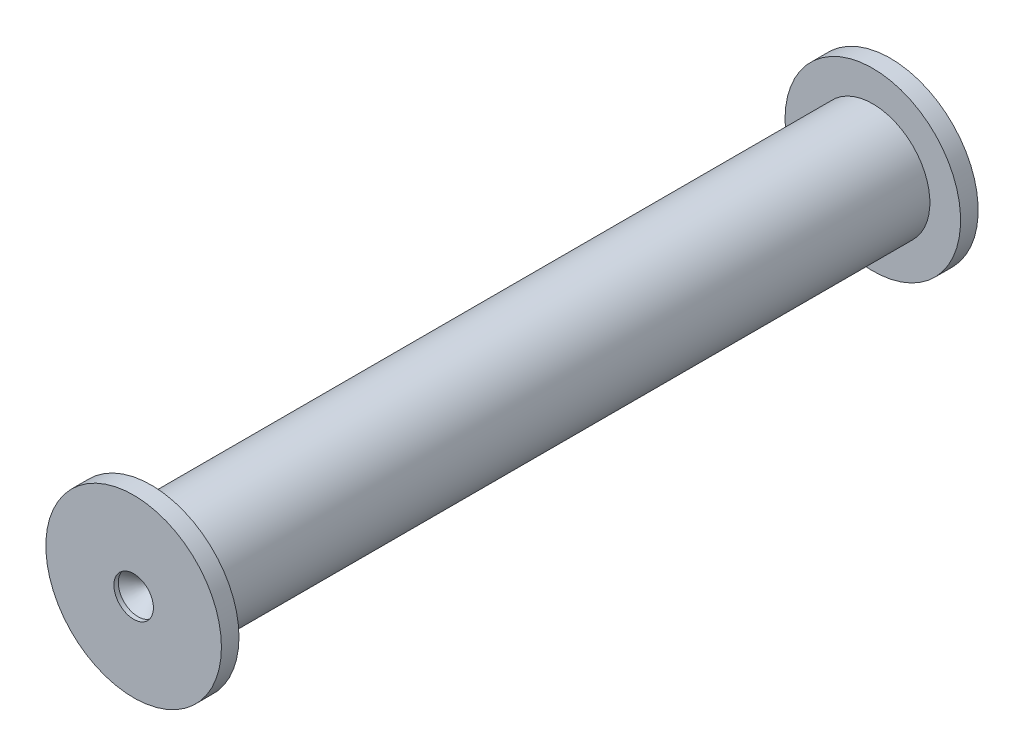
ISO-10303-21;
HEADER;
FILE_DESCRIPTION(('STEP AP214'),'2;1');
FILE_NAME('part.step','',(''),(''),'','','');
FILE_SCHEMA(('AUTOMOTIVE_DESIGN { 1 0 10303 214 1 1 1 1 }'));
ENDSEC;
DATA;
#1=APPLICATION_CONTEXT('core data for automotive mechanical design processes');
#2=APPLICATION_PROTOCOL_DEFINITION('international standard','automotive_design',2000,#1);
#3=PRODUCT_CONTEXT('',#1,'mechanical');
#4=PRODUCT('Part','Part','',(#3));
#5=PRODUCT_RELATED_PRODUCT_CATEGORY('part','',(#4));
#6=PRODUCT_DEFINITION_FORMATION('','',#4);
#7=PRODUCT_DEFINITION_CONTEXT('part definition',#1,'design');
#8=PRODUCT_DEFINITION('design','',#6,#7);
#9=PRODUCT_DEFINITION_SHAPE('','',#8);
#10=(LENGTH_UNIT() NAMED_UNIT(*) SI_UNIT(.MILLI.,.METRE.));
#11=(NAMED_UNIT(*) PLANE_ANGLE_UNIT() SI_UNIT($,.RADIAN.));
#12=(NAMED_UNIT(*) SI_UNIT($,.STERADIAN.) SOLID_ANGLE_UNIT());
#13=UNCERTAINTY_MEASURE_WITH_UNIT(LENGTH_MEASURE(1.E-05),#10,'distance_accuracy_value','');
#14=(GEOMETRIC_REPRESENTATION_CONTEXT(3) GLOBAL_UNCERTAINTY_ASSIGNED_CONTEXT((#13)) GLOBAL_UNIT_ASSIGNED_CONTEXT((#10,
#11,#12)) REPRESENTATION_CONTEXT('',''));
#15=CARTESIAN_POINT('',(0.,0.,0.));
#16=DIRECTION('',(0.,0.,1.));
#17=DIRECTION('',(1.,0.,0.));
#18=AXIS2_PLACEMENT_3D('',#15,#16,#17);
#19=CARTESIAN_POINT('',(3.3,-31.2819394424174,0.1));
#20=DIRECTION('',(0.,0.,-1.));
#21=DIRECTION('',(-1.,0.,0.));
#22=AXIS2_PLACEMENT_3D('',#19,#20,#21);
#23=CYLINDRICAL_SURFACE('',#22,1.3);
#24=CARTESIAN_POINT('',(3.3,-31.2819394424174,0.1));
#25=DIRECTION('',(0.,0.,1.));
#26=DIRECTION('',(1.,0.,0.));
#27=AXIS2_PLACEMENT_3D('',#24,#25,#26);
#28=CIRCLE('',#27,1.3);
#29=CARTESIAN_POINT('',(4.6,-31.2819394424174,0.1));
#30=VERTEX_POINT('',#29);
#31=EDGE_CURVE('E50',#30,#30,#28,.T.);
#32=ORIENTED_EDGE('',*,*,#31,.F.);
#33=EDGE_LOOP('',(#32));
#34=FACE_BOUND('',#33,.T.);
#35=CARTESIAN_POINT('',(3.3,-31.2819394424174,-16.34));
#36=DIRECTION('',(0.,0.,-1.));
#37=DIRECTION('',(-1.,0.,0.));
#38=AXIS2_PLACEMENT_3D('',#35,#36,#37);
#39=CIRCLE('',#38,1.3);
#40=CARTESIAN_POINT('',(2.,-31.2819394424174,-16.34));
#41=VERTEX_POINT('',#40);
#42=EDGE_CURVE('E57',#41,#41,#39,.T.);
#43=ORIENTED_EDGE('',*,*,#42,.F.);
#44=EDGE_LOOP('',(#43));
#45=FACE_BOUND('',#44,.T.);
#46=ADVANCED_FACE('F30',(#34,#45),#23,.T.);
#47=CARTESIAN_POINT('',(3.3,-31.2819394424174,0.1));
#48=DIRECTION('',(0.,0.,1.));
#49=DIRECTION('',(1.,0.,0.));
#50=AXIS2_PLACEMENT_3D('',#47,#48,#49);
#51=PLANE('',#50);
#52=CARTESIAN_POINT('',(3.3,-31.2819394424174,0.1));
#53=DIRECTION('',(0.,0.,1.));
#54=DIRECTION('',(1.,0.,0.));
#55=AXIS2_PLACEMENT_3D('',#52,#53,#54);
#56=CIRCLE('',#55,2.);
#57=CARTESIAN_POINT('',(5.3,-31.2819394424174,0.1));
#58=VERTEX_POINT('',#57);
#59=EDGE_CURVE('E54',#58,#58,#56,.T.);
#60=ORIENTED_EDGE('',*,*,#59,.F.);
#61=EDGE_LOOP('',(#60));
#62=FACE_BOUND('',#61,.T.);
#63=ORIENTED_EDGE('',*,*,#31,.T.);
#64=EDGE_LOOP('',(#63));
#65=FACE_BOUND('',#64,.T.);
#66=ADVANCED_FACE('F87',(#62,#65),#51,.F.);
#67=CARTESIAN_POINT('',(3.3,-31.2819394424174,0.5));
#68=DIRECTION('',(0.,0.,-1.));
#69=DIRECTION('',(-1.,0.,0.));
#70=AXIS2_PLACEMENT_3D('',#67,#68,#69);
#71=CYLINDRICAL_SURFACE('',#70,2.);
#72=CARTESIAN_POINT('',(3.3,-31.2819394424174,0.5));
#73=DIRECTION('',(0.,0.,1.));
#74=DIRECTION('',(1.,0.,0.));
#75=AXIS2_PLACEMENT_3D('',#72,#73,#74);
#76=CIRCLE('',#75,2.);
#77=CARTESIAN_POINT('',(5.3,-31.2819394424174,0.5));
#78=VERTEX_POINT('',#77);
#79=EDGE_CURVE('E53',#78,#78,#76,.T.);
#80=ORIENTED_EDGE('',*,*,#79,.F.);
#81=EDGE_LOOP('',(#80));
#82=FACE_BOUND('',#81,.T.);
#83=ORIENTED_EDGE('',*,*,#59,.T.);
#84=EDGE_LOOP('',(#83));
#85=FACE_BOUND('',#84,.T.);
#86=ADVANCED_FACE('F81',(#82,#85),#71,.T.);
#87=CARTESIAN_POINT('',(3.3,-31.2819394424174,0.5));
#88=DIRECTION('',(0.,0.,1.));
#89=DIRECTION('',(1.,0.,0.));
#90=AXIS2_PLACEMENT_3D('',#87,#88,#89);
#91=PLANE('',#90);
#92=CARTESIAN_POINT('',(3.3,-31.2819394424174,0.5));
#93=DIRECTION('',(0.,0.,1.));
#94=DIRECTION('',(1.,0.,0.));
#95=AXIS2_PLACEMENT_3D('',#92,#93,#94);
#96=CIRCLE('',#95,0.449999999999999);
#97=CARTESIAN_POINT('',(3.75,-31.2819394424174,0.5));
#98=VERTEX_POINT('',#97);
#99=EDGE_CURVE('E71',#98,#98,#96,.T.);
#100=ORIENTED_EDGE('',*,*,#99,.F.);
#101=EDGE_LOOP('',(#100));
#102=FACE_BOUND('',#101,.T.);
#103=ORIENTED_EDGE('',*,*,#79,.T.);
#104=EDGE_LOOP('',(#103));
#105=FACE_BOUND('',#104,.T.);
#106=ADVANCED_FACE('F77',(#102,#105),#91,.T.);
#107=CARTESIAN_POINT('',(3.3,-31.2819394424174,-16.34));
#108=DIRECTION('',(0.,0.,-1.));
#109=DIRECTION('',(-1.,0.,0.));
#110=AXIS2_PLACEMENT_3D('',#107,#108,#109);
#111=PLANE('',#110);
#112=CARTESIAN_POINT('',(3.3,-31.2819394424174,-16.34));
#113=DIRECTION('',(0.,0.,-1.));
#114=DIRECTION('',(-1.,0.,0.));
#115=AXIS2_PLACEMENT_3D('',#112,#113,#114);
#116=CIRCLE('',#115,2.);
#117=CARTESIAN_POINT('',(1.3,-31.2819394424174,-16.34));
#118=VERTEX_POINT('',#117);
#119=EDGE_CURVE('E63',#118,#118,#116,.T.);
#120=ORIENTED_EDGE('',*,*,#119,.F.);
#121=EDGE_LOOP('',(#120));
#122=FACE_BOUND('',#121,.T.);
#123=ORIENTED_EDGE('',*,*,#42,.T.);
#124=EDGE_LOOP('',(#123));
#125=FACE_BOUND('',#124,.T.);
#126=ADVANCED_FACE('F80',(#122,#125),#111,.F.);
#127=CARTESIAN_POINT('',(3.3,-31.2819394424174,-16.74));
#128=DIRECTION('',(0.,0.,1.));
#129=DIRECTION('',(1.,0.,0.));
#130=AXIS2_PLACEMENT_3D('',#127,#128,#129);
#131=CYLINDRICAL_SURFACE('',#130,2.);
#132=CARTESIAN_POINT('',(3.3,-31.2819394424174,-16.74));
#133=DIRECTION('',(0.,0.,-1.));
#134=DIRECTION('',(-1.,0.,0.));
#135=AXIS2_PLACEMENT_3D('',#132,#133,#134);
#136=CIRCLE('',#135,2.);
#137=CARTESIAN_POINT('',(1.3,-31.2819394424174,-16.74));
#138=VERTEX_POINT('',#137);
#139=EDGE_CURVE('E62',#138,#138,#136,.T.);
#140=ORIENTED_EDGE('',*,*,#139,.F.);
#141=EDGE_LOOP('',(#140));
#142=FACE_BOUND('',#141,.T.);
#143=ORIENTED_EDGE('',*,*,#119,.T.);
#144=EDGE_LOOP('',(#143));
#145=FACE_BOUND('',#144,.T.);
#146=ADVANCED_FACE('F102',(#142,#145),#131,.T.);
#147=CARTESIAN_POINT('',(3.3,-31.2819394424174,-16.74));
#148=DIRECTION('',(0.,0.,-1.));
#149=DIRECTION('',(-1.,0.,0.));
#150=AXIS2_PLACEMENT_3D('',#147,#148,#149);
#151=PLANE('',#150);
#152=CARTESIAN_POINT('',(3.3,-31.2819394424174,-16.74));
#153=DIRECTION('',(0.,0.,-1.));
#154=DIRECTION('',(-1.,0.,0.));
#155=AXIS2_PLACEMENT_3D('',#152,#153,#154);
#156=CIRCLE('',#155,0.449999999999999);
#157=CARTESIAN_POINT('',(2.85,-31.2819394424174,-16.74));
#158=VERTEX_POINT('',#157);
#159=EDGE_CURVE('E66',#158,#158,#156,.T.);
#160=ORIENTED_EDGE('',*,*,#159,.F.);
#161=EDGE_LOOP('',(#160));
#162=FACE_BOUND('',#161,.T.);
#163=ORIENTED_EDGE('',*,*,#139,.T.);
#164=EDGE_LOOP('',(#163));
#165=FACE_BOUND('',#164,.T.);
#166=ADVANCED_FACE('F108',(#162,#165),#151,.T.);
#167=CARTESIAN_POINT('',(3.3,-31.2819394424174,-16.24));
#168=DIRECTION('',(0.,0.,-1.));
#169=DIRECTION('',(-1.,0.,0.));
#170=AXIS2_PLACEMENT_3D('',#167,#168,#169);
#171=CYLINDRICAL_SURFACE('',#170,0.449999999999999);
#172=CARTESIAN_POINT('',(3.3,-31.2819394424174,-16.64));
#173=DIRECTION('',(0.,0.,-1.));
#174=DIRECTION('',(-1.,0.,0.));
#175=AXIS2_PLACEMENT_3D('',#172,#173,#174);
#176=CIRCLE('',#175,0.449999999999999);
#177=CARTESIAN_POINT('',(2.85,-31.2819394424174,-16.64));
#178=VERTEX_POINT('',#177);
#179=EDGE_CURVE('E41',#178,#178,#176,.F.);
#180=ORIENTED_EDGE('',*,*,#179,.T.);
#181=EDGE_LOOP('',(#180));
#182=FACE_BOUND('',#181,.T.);
#183=ORIENTED_EDGE('',*,*,#159,.T.);
#184=EDGE_LOOP('',(#183));
#185=FACE_BOUND('',#184,.T.);
#186=ADVANCED_FACE('F124',(#182,#185),#171,.F.);
#187=CARTESIAN_POINT('',(3.3,-31.2819394424174,-16.24));
#188=DIRECTION('',(0.,0.,-1.));
#189=DIRECTION('',(-1.,0.,0.));
#190=AXIS2_PLACEMENT_3D('',#187,#188,#189);
#191=PLANE('',#190);
#192=CARTESIAN_POINT('',(3.3,-31.2819394424174,-16.24));
#193=DIRECTION('',(0.,0.,-1.));
#194=DIRECTION('',(-1.,0.,0.));
#195=AXIS2_PLACEMENT_3D('',#192,#193,#194);
#196=CIRCLE('',#195,0.049999999999998);
#197=CARTESIAN_POINT('',(3.25,-31.2819394424174,-16.24));
#198=VERTEX_POINT('',#197);
#199=EDGE_CURVE('E45',#198,#198,#196,.T.);
#200=ORIENTED_EDGE('',*,*,#199,.T.);
#201=EDGE_LOOP('',(#200));
#202=FACE_BOUND('',#201,.T.);
#203=ADVANCED_FACE('F116',(#202),#191,.T.);
#204=CARTESIAN_POINT('',(3.3,-31.2819394424174,-16.24));
#205=DIRECTION('',(0.,0.,-1.));
#206=DIRECTION('',(-1.,0.,0.));
#207=AXIS2_PLACEMENT_3D('',#204,#205,#206);
#208=CONICAL_SURFACE('',#207,0.049999999999998,0.785398163397449);
#209=CARTESIAN_POINT('',(2.85,-31.2819394424174,-16.64));
#210=CARTESIAN_POINT('',(2.85416666666667,-31.2819394424174,-16.6358333333333));
#211=CARTESIAN_POINT('',(2.85833333333333,-31.2819394424174,-16.6316666666667));
#212=CARTESIAN_POINT('',(2.86666666666667,-31.2819394424174,-16.6233333333333));
#213=CARTESIAN_POINT('',(2.87083333333334,-31.2819394424174,-16.6191666666667));
#214=CARTESIAN_POINT('',(2.87916666666667,-31.2819394424174,-16.6108333333333));
#215=CARTESIAN_POINT('',(2.88333333333334,-31.2819394424174,-16.6066666666667));
#216=CARTESIAN_POINT('',(2.89166666666667,-31.2819394424174,-16.5983333333333));
#217=CARTESIAN_POINT('',(2.89583333333334,-31.2819394424174,-16.5941666666667));
#218=CARTESIAN_POINT('',(2.90416666666667,-31.2819394424174,-16.5858333333333));
#219=CARTESIAN_POINT('',(2.90833333333334,-31.2819394424174,-16.5816666666667));
#220=CARTESIAN_POINT('',(2.91666666666667,-31.2819394424174,-16.5733333333333));
#221=CARTESIAN_POINT('',(2.92083333333334,-31.2819394424174,-16.5691666666667));
#222=CARTESIAN_POINT('',(2.92916666666667,-31.2819394424174,-16.5608333333333));
#223=CARTESIAN_POINT('',(2.93333333333334,-31.2819394424174,-16.5566666666667));
#224=CARTESIAN_POINT('',(2.94166666666667,-31.2819394424174,-16.5483333333333));
#225=CARTESIAN_POINT('',(2.94583333333334,-31.2819394424174,-16.5441666666667));
#226=CARTESIAN_POINT('',(2.95416666666667,-31.2819394424174,-16.5358333333333));
#227=CARTESIAN_POINT('',(2.95833333333334,-31.2819394424174,-16.5316666666667));
#228=CARTESIAN_POINT('',(2.96666666666667,-31.2819394424174,-16.5233333333333));
#229=CARTESIAN_POINT('',(2.97083333333334,-31.2819394424174,-16.5191666666667));
#230=CARTESIAN_POINT('',(2.97916666666667,-31.2819394424174,-16.5108333333333));
#231=CARTESIAN_POINT('',(2.98333333333334,-31.2819394424174,-16.5066666666667));
#232=CARTESIAN_POINT('',(2.99166666666667,-31.2819394424174,-16.4983333333333));
#233=CARTESIAN_POINT('',(2.99583333333334,-31.2819394424174,-16.4941666666667));
#234=CARTESIAN_POINT('',(3.00416666666667,-31.2819394424174,-16.4858333333333));
#235=CARTESIAN_POINT('',(3.00833333333334,-31.2819394424174,-16.4816666666667));
#236=CARTESIAN_POINT('',(3.01666666666667,-31.2819394424174,-16.4733333333333));
#237=CARTESIAN_POINT('',(3.02083333333334,-31.2819394424174,-16.4691666666667));
#238=CARTESIAN_POINT('',(3.02916666666667,-31.2819394424174,-16.4608333333333));
#239=CARTESIAN_POINT('',(3.03333333333334,-31.2819394424174,-16.4566666666667));
#240=CARTESIAN_POINT('',(3.04166666666667,-31.2819394424174,-16.4483333333333));
#241=CARTESIAN_POINT('',(3.04583333333334,-31.2819394424174,-16.4441666666667));
#242=CARTESIAN_POINT('',(3.05416666666667,-31.2819394424174,-16.4358333333333));
#243=CARTESIAN_POINT('',(3.05833333333334,-31.2819394424174,-16.4316666666667));
#244=CARTESIAN_POINT('',(3.06666666666667,-31.2819394424174,-16.4233333333333));
#245=CARTESIAN_POINT('',(3.07083333333334,-31.2819394424174,-16.4191666666667));
#246=CARTESIAN_POINT('',(3.07916666666667,-31.2819394424174,-16.4108333333333));
#247=CARTESIAN_POINT('',(3.08333333333334,-31.2819394424174,-16.4066666666667));
#248=CARTESIAN_POINT('',(3.09166666666667,-31.2819394424174,-16.3983333333333));
#249=CARTESIAN_POINT('',(3.09583333333334,-31.2819394424174,-16.3941666666667));
#250=CARTESIAN_POINT('',(3.10416666666667,-31.2819394424174,-16.3858333333333));
#251=CARTESIAN_POINT('',(3.10833333333334,-31.2819394424174,-16.3816666666667));
#252=CARTESIAN_POINT('',(3.11666666666667,-31.2819394424174,-16.3733333333333));
#253=CARTESIAN_POINT('',(3.12083333333334,-31.2819394424174,-16.3691666666667));
#254=CARTESIAN_POINT('',(3.12916666666667,-31.2819394424174,-16.3608333333333));
#255=CARTESIAN_POINT('',(3.13333333333334,-31.2819394424174,-16.3566666666667));
#256=CARTESIAN_POINT('',(3.14166666666667,-31.2819394424174,-16.3483333333333));
#257=CARTESIAN_POINT('',(3.14583333333334,-31.2819394424174,-16.3441666666667));
#258=CARTESIAN_POINT('',(3.15416666666667,-31.2819394424174,-16.3358333333333));
#259=CARTESIAN_POINT('',(3.15833333333334,-31.2819394424174,-16.3316666666667));
#260=CARTESIAN_POINT('',(3.16666666666667,-31.2819394424174,-16.3233333333333));
#261=CARTESIAN_POINT('',(3.17083333333334,-31.2819394424174,-16.3191666666667));
#262=CARTESIAN_POINT('',(3.17916666666667,-31.2819394424174,-16.3108333333333));
#263=CARTESIAN_POINT('',(3.18333333333334,-31.2819394424174,-16.3066666666667));
#264=CARTESIAN_POINT('',(3.19166666666667,-31.2819394424174,-16.2983333333333));
#265=CARTESIAN_POINT('',(3.19583333333334,-31.2819394424174,-16.2941666666667));
#266=CARTESIAN_POINT('',(3.20416666666667,-31.2819394424174,-16.2858333333333));
#267=CARTESIAN_POINT('',(3.20833333333334,-31.2819394424174,-16.2816666666667));
#268=CARTESIAN_POINT('',(3.21666666666667,-31.2819394424174,-16.2733333333333));
#269=CARTESIAN_POINT('',(3.22083333333334,-31.2819394424174,-16.2691666666667));
#270=CARTESIAN_POINT('',(3.22916666666667,-31.2819394424174,-16.2608333333333));
#271=CARTESIAN_POINT('',(3.23333333333334,-31.2819394424174,-16.2566666666667));
#272=CARTESIAN_POINT('',(3.24166666666667,-31.2819394424174,-16.2483333333333));
#273=CARTESIAN_POINT('',(3.24583333333334,-31.2819394424174,-16.2441666666667));
#274=CARTESIAN_POINT('',(3.25,-31.2819394424174,-16.24));
#275=B_SPLINE_CURVE_WITH_KNOTS('',3,(#209,#210,#211,#212,#213,#214,#215,#216,#217,#218,#219,
#220,#221,#222,#223,#224,#225,#226,#227,#228,#229,#230,#231,#232,#233,#234,#235,#236,#237,#238,
#239,#240,#241,#242,#243,#244,#245,#246,#247,#248,#249,#250,#251,#252,#253,#254,#255,#256,#257,
#258,#259,#260,#261,#262,#263,#264,#265,#266,#267,#268,#269,#270,#271,#272,#273,#274),
.UNSPECIFIED.,.F.,.F.,(4,2,2,2,2,2,2,2,2,2,2,2,2,2,2,2,2,2,2,2,2,2,2,2,2,2,2,2,2,2,2,2,4),(0.,
0.0176776695296651,0.0353553390593278,0.0530330085889932,0.0707106781186558,0.088388347648321,
0.106066017177984,0.123743686707647,0.141421356237312,0.159099025766975,0.17677669529664,
0.194454364826302,0.212132034355965,0.229809703885631,0.247487373415293,0.265165042944958,
0.282842712474621,0.300520382004284,0.318198051533949,0.335875721063612,0.353553390593277,
0.37123106012294,0.388908729652603,0.406586399182268,0.424264068711931,0.441941738241596,
0.459619407771258,0.477297077300921,0.494974746830587,0.512652416360249,0.530330085889914,
0.548007755419577,0.565685424949242),.UNSPECIFIED.);
#276=EDGE_CURVE('BSEAM114',#178,#198,#275,.T.);
#277=ORIENTED_EDGE('',*,*,#179,.F.);
#278=ORIENTED_EDGE('',*,*,#199,.F.);
#279=ORIENTED_EDGE('',*,*,#276,.T.);
#280=ORIENTED_EDGE('',*,*,#276,.F.);
#281=EDGE_LOOP('',(#277,#279,#278,#280));
#282=FACE_BOUND('',#281,.T.);
#283=ADVANCED_FACE('F114',(#282),#208,.F.);
#284=CARTESIAN_POINT('',(3.3,-31.2819394424174,0.));
#285=DIRECTION('',(0.,0.,1.));
#286=DIRECTION('',(1.,0.,0.));
#287=AXIS2_PLACEMENT_3D('',#284,#285,#286);
#288=CYLINDRICAL_SURFACE('',#287,0.449999999999999);
#289=CARTESIAN_POINT('',(3.3,-31.2819394424174,0.399999999999997));
#290=DIRECTION('',(0.,0.,1.));
#291=DIRECTION('',(1.,0.,0.));
#292=AXIS2_PLACEMENT_3D('',#289,#290,#291);
#293=CIRCLE('',#292,0.449999999999999);
#294=CARTESIAN_POINT('',(3.75,-31.2819394424174,0.399999999999997));
#295=VERTEX_POINT('',#294);
#296=EDGE_CURVE('E10',#295,#295,#293,.F.);
#297=ORIENTED_EDGE('',*,*,#296,.T.);
#298=EDGE_LOOP('',(#297));
#299=FACE_BOUND('',#298,.T.);
#300=ORIENTED_EDGE('',*,*,#99,.T.);
#301=EDGE_LOOP('',(#300));
#302=FACE_BOUND('',#301,.T.);
#303=ADVANCED_FACE('F75',(#299,#302),#288,.F.);
#304=CARTESIAN_POINT('',(3.3,-31.2819394424174,0.));
#305=DIRECTION('',(0.,0.,1.));
#306=DIRECTION('',(1.,0.,0.));
#307=AXIS2_PLACEMENT_3D('',#304,#305,#306);
#308=PLANE('',#307);
#309=CARTESIAN_POINT('',(3.3,-31.2819394424174,0.));
#310=DIRECTION('',(0.,0.,1.));
#311=DIRECTION('',(1.,0.,0.));
#312=AXIS2_PLACEMENT_3D('',#309,#310,#311);
#313=CIRCLE('',#312,0.049999999999998);
#314=CARTESIAN_POINT('',(3.35,-31.2819394424174,0.));
#315=VERTEX_POINT('',#314);
#316=EDGE_CURVE('E37',#315,#315,#313,.T.);
#317=ORIENTED_EDGE('',*,*,#316,.T.);
#318=EDGE_LOOP('',(#317));
#319=FACE_BOUND('',#318,.T.);
#320=ADVANCED_FACE('F122',(#319),#308,.T.);
#321=CARTESIAN_POINT('',(3.3,-31.2819394424174,0.));
#322=DIRECTION('',(0.,0.,1.));
#323=DIRECTION('',(1.,0.,0.));
#324=AXIS2_PLACEMENT_3D('',#321,#322,#323);
#325=CONICAL_SURFACE('',#324,0.049999999999998,0.785398163397454);
#326=CARTESIAN_POINT('',(3.75,-31.2819394424174,0.399999999999997));
#327=CARTESIAN_POINT('',(3.74583333333333,-31.2819394424174,0.39583333333333));
#328=CARTESIAN_POINT('',(3.74166666666667,-31.2819394424174,0.391666666666663));
#329=CARTESIAN_POINT('',(3.73333333333333,-31.2819394424174,0.38333333333333));
#330=CARTESIAN_POINT('',(3.72916666666667,-31.2819394424174,0.379166666666664));
#331=CARTESIAN_POINT('',(3.72083333333333,-31.2819394424174,0.37083333333333));
#332=CARTESIAN_POINT('',(3.71666666666667,-31.2819394424174,0.366666666666664));
#333=CARTESIAN_POINT('',(3.70833333333333,-31.2819394424174,0.35833333333333));
#334=CARTESIAN_POINT('',(3.70416666666667,-31.2819394424174,0.354166666666664));
#335=CARTESIAN_POINT('',(3.69583333333333,-31.2819394424174,0.345833333333331));
#336=CARTESIAN_POINT('',(3.69166666666667,-31.2819394424174,0.341666666666664));
#337=CARTESIAN_POINT('',(3.68333333333333,-31.2819394424174,0.333333333333331));
#338=CARTESIAN_POINT('',(3.67916666666667,-31.2819394424174,0.329166666666664));
#339=CARTESIAN_POINT('',(3.67083333333333,-31.2819394424174,0.320833333333331));
#340=CARTESIAN_POINT('',(3.66666666666667,-31.2819394424174,0.316666666666664));
#341=CARTESIAN_POINT('',(3.65833333333333,-31.2819394424174,0.308333333333331));
#342=CARTESIAN_POINT('',(3.65416666666667,-31.2819394424174,0.304166666666664));
#343=CARTESIAN_POINT('',(3.64583333333333,-31.2819394424174,0.295833333333331));
#344=CARTESIAN_POINT('',(3.64166666666666,-31.2819394424174,0.291666666666664));
#345=CARTESIAN_POINT('',(3.63333333333333,-31.2819394424174,0.283333333333331));
#346=CARTESIAN_POINT('',(3.62916666666667,-31.2819394424174,0.279166666666664));
#347=CARTESIAN_POINT('',(3.62083333333333,-31.2819394424174,0.270833333333331));
#348=CARTESIAN_POINT('',(3.61666666666667,-31.2819394424174,0.266666666666664));
#349=CARTESIAN_POINT('',(3.60833333333333,-31.2819394424174,0.258333333333331));
#350=CARTESIAN_POINT('',(3.60416666666666,-31.2819394424174,0.254166666666665));
#351=CARTESIAN_POINT('',(3.59583333333333,-31.2819394424174,0.245833333333331));
#352=CARTESIAN_POINT('',(3.59166666666667,-31.2819394424174,0.241666666666665));
#353=CARTESIAN_POINT('',(3.58333333333333,-31.2819394424174,0.233333333333331));
#354=CARTESIAN_POINT('',(3.57916666666666,-31.2819394424174,0.229166666666665));
#355=CARTESIAN_POINT('',(3.57083333333333,-31.2819394424174,0.220833333333332));
#356=CARTESIAN_POINT('',(3.56666666666667,-31.2819394424174,0.216666666666665));
#357=CARTESIAN_POINT('',(3.55833333333333,-31.2819394424174,0.208333333333332));
#358=CARTESIAN_POINT('',(3.55416666666666,-31.2819394424174,0.204166666666665));
#359=CARTESIAN_POINT('',(3.54583333333333,-31.2819394424174,0.195833333333332));
#360=CARTESIAN_POINT('',(3.54166666666666,-31.2819394424174,0.191666666666665));
#361=CARTESIAN_POINT('',(3.53333333333333,-31.2819394424174,0.183333333333332));
#362=CARTESIAN_POINT('',(3.52916666666667,-31.2819394424174,0.179166666666665));
#363=CARTESIAN_POINT('',(3.52083333333333,-31.2819394424174,0.170833333333332));
#364=CARTESIAN_POINT('',(3.51666666666666,-31.2819394424174,0.166666666666665));
#365=CARTESIAN_POINT('',(3.50833333333333,-31.2819394424174,0.158333333333332));
#366=CARTESIAN_POINT('',(3.50416666666666,-31.2819394424174,0.154166666666665));
#367=CARTESIAN_POINT('',(3.49583333333333,-31.2819394424174,0.145833333333332));
#368=CARTESIAN_POINT('',(3.49166666666666,-31.2819394424174,0.141666666666666));
#369=CARTESIAN_POINT('',(3.48333333333333,-31.2819394424174,0.133333333333332));
#370=CARTESIAN_POINT('',(3.47916666666666,-31.2819394424174,0.129166666666666));
#371=CARTESIAN_POINT('',(3.47083333333333,-31.2819394424174,0.120833333333332));
#372=CARTESIAN_POINT('',(3.46666666666666,-31.2819394424174,0.116666666666666));
#373=CARTESIAN_POINT('',(3.45833333333333,-31.2819394424174,0.108333333333333));
#374=CARTESIAN_POINT('',(3.45416666666666,-31.2819394424174,0.104166666666666));
#375=CARTESIAN_POINT('',(3.44583333333333,-31.2819394424174,0.0958333333333325));
#376=CARTESIAN_POINT('',(3.44166666666666,-31.2819394424174,0.091666666666666));
#377=CARTESIAN_POINT('',(3.43333333333333,-31.2819394424174,0.0833333333333327));
#378=CARTESIAN_POINT('',(3.42916666666666,-31.2819394424174,0.079166666666666));
#379=CARTESIAN_POINT('',(3.42083333333333,-31.2819394424174,0.0708333333333327));
#380=CARTESIAN_POINT('',(3.41666666666666,-31.2819394424174,0.0666666666666662));
#381=CARTESIAN_POINT('',(3.40833333333333,-31.2819394424174,0.0583333333333329));
#382=CARTESIAN_POINT('',(3.40416666666666,-31.2819394424174,0.0541666666666662));
#383=CARTESIAN_POINT('',(3.39583333333333,-31.2819394424174,0.045833333333333));
#384=CARTESIAN_POINT('',(3.39166666666666,-31.2819394424174,0.0416666666666664));
#385=CARTESIAN_POINT('',(3.38333333333333,-31.2819394424174,0.0333333333333331));
#386=CARTESIAN_POINT('',(3.37916666666666,-31.2819394424174,0.0291666666666664));
#387=CARTESIAN_POINT('',(3.37083333333333,-31.2819394424174,0.0208333333333331));
#388=CARTESIAN_POINT('',(3.36666666666666,-31.2819394424174,0.0166666666666665));
#389=CARTESIAN_POINT('',(3.35833333333333,-31.2819394424174,0.00833333333333336));
#390=CARTESIAN_POINT('',(3.35416666666666,-31.2819394424174,0.00416666666666676));
#391=CARTESIAN_POINT('',(3.35,-31.2819394424174,0.));
#392=B_SPLINE_CURVE_WITH_KNOTS('',3,(#326,#327,#328,#329,#330,#331,#332,#333,#334,#335,#336,
#337,#338,#339,#340,#341,#342,#343,#344,#345,#346,#347,#348,#349,#350,#351,#352,#353,#354,#355,
#356,#357,#358,#359,#360,#361,#362,#363,#364,#365,#366,#367,#368,#369,#370,#371,#372,#373,#374,
#375,#376,#377,#378,#379,#380,#381,#382,#383,#384,#385,#386,#387,#388,#389,#390,#391),
.UNSPECIFIED.,.F.,.F.,(4,2,2,2,2,2,2,2,2,2,2,2,2,2,2,2,2,2,2,2,2,2,2,2,2,2,2,2,2,2,2,2,4),(0.,
0.0176776695296636,0.0353553390593274,0.053033008588991,0.0707106781186546,0.0883883476483181,
0.106066017177982,0.123743686707646,0.141421356237309,0.159099025766973,0.176776695296637,
0.1944543648263,0.212132034355964,0.229809703885628,0.247487373415291,0.265165042944955,
0.282842712474618,0.300520382004282,0.318198051533946,0.335875721063609,0.353553390593273,
0.371231060122937,0.3889087296526,0.406586399182264,0.424264068711928,0.441941738241591,
0.459619407771255,0.477297077300919,0.494974746830582,0.512652416360246,0.530330085889909,
0.548007755419573,0.565685424949237),.UNSPECIFIED.);
#393=EDGE_CURVE('BSEAM32',#295,#315,#392,.T.);
#394=ORIENTED_EDGE('',*,*,#296,.F.);
#395=ORIENTED_EDGE('',*,*,#316,.F.);
#396=ORIENTED_EDGE('',*,*,#393,.T.);
#397=ORIENTED_EDGE('',*,*,#393,.F.);
#398=EDGE_LOOP('',(#394,#396,#395,#397));
#399=FACE_BOUND('',#398,.T.);
#400=ADVANCED_FACE('F32',(#399),#325,.F.);
#401=CLOSED_SHELL('',(#46,#66,#86,#106,#126,#146,#166,#186,#203,#283,#303,#320,#400));
#402=MANIFOLD_SOLID_BREP('B2',#401);
#403=ADVANCED_BREP_SHAPE_REPRESENTATION('',(#18,#402),#14);
#404=SHAPE_DEFINITION_REPRESENTATION(#9,#403);
ENDSEC;
END-ISO-10303-21;
